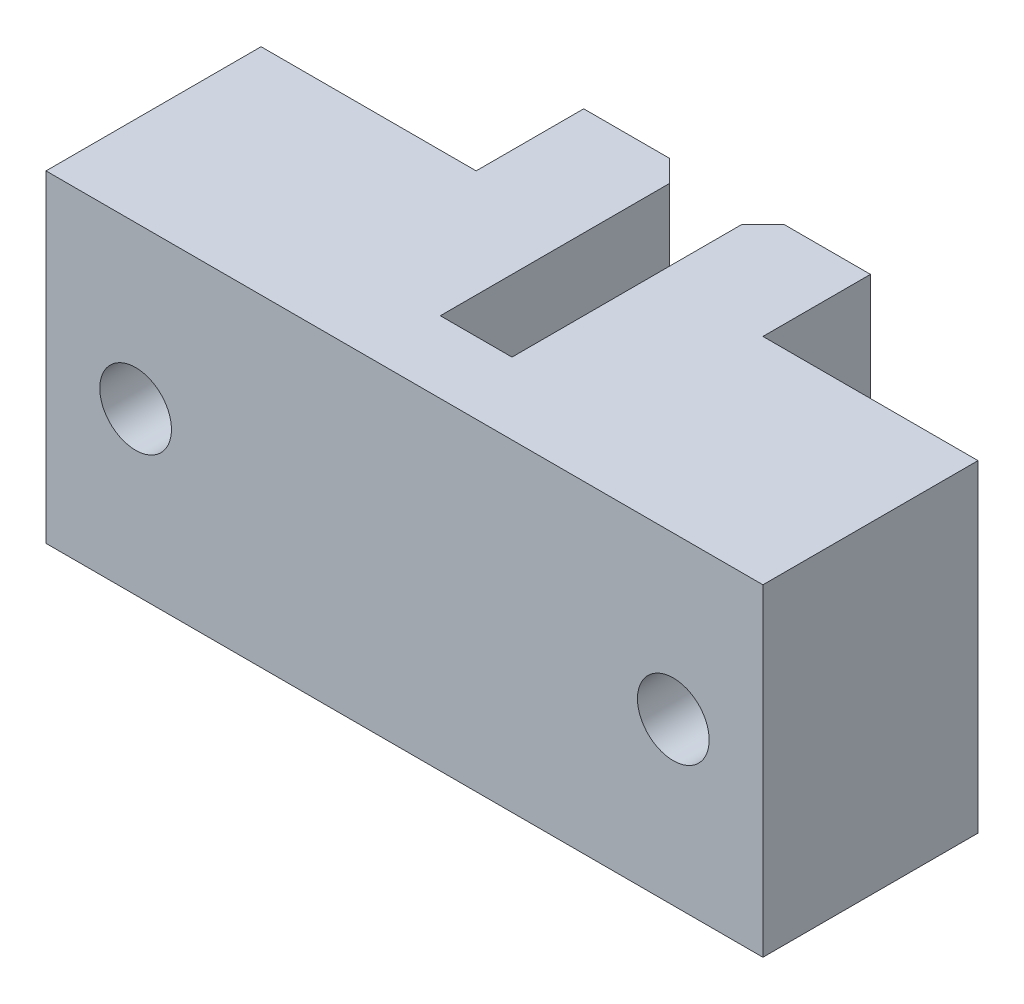
ISO-10303-21;
HEADER;
FILE_DESCRIPTION(('STEP AP214'),'2;1');
FILE_NAME('part.step','',(''),(''),'','','');
FILE_SCHEMA(('AUTOMOTIVE_DESIGN { 1 0 10303 214 1 1 1 1 }'));
ENDSEC;
DATA;
#1=APPLICATION_CONTEXT('core data for automotive mechanical design processes');
#2=APPLICATION_PROTOCOL_DEFINITION('international standard','automotive_design',2000,#1);
#3=PRODUCT_CONTEXT('',#1,'mechanical');
#4=PRODUCT('Part','Part','',(#3));
#5=PRODUCT_RELATED_PRODUCT_CATEGORY('part','',(#4));
#6=PRODUCT_DEFINITION_FORMATION('','',#4);
#7=PRODUCT_DEFINITION_CONTEXT('part definition',#1,'design');
#8=PRODUCT_DEFINITION('design','',#6,#7);
#9=PRODUCT_DEFINITION_SHAPE('','',#8);
#10=(LENGTH_UNIT() NAMED_UNIT(*) SI_UNIT(.MILLI.,.METRE.));
#11=(NAMED_UNIT(*) PLANE_ANGLE_UNIT() SI_UNIT($,.RADIAN.));
#12=(NAMED_UNIT(*) SI_UNIT($,.STERADIAN.) SOLID_ANGLE_UNIT());
#13=UNCERTAINTY_MEASURE_WITH_UNIT(LENGTH_MEASURE(1.E-05),#10,'distance_accuracy_value','');
#14=(GEOMETRIC_REPRESENTATION_CONTEXT(3) GLOBAL_UNCERTAINTY_ASSIGNED_CONTEXT((#13)) GLOBAL_UNIT_ASSIGNED_CONTEXT((#10,
#11,#12)) REPRESENTATION_CONTEXT('',''));
#15=CARTESIAN_POINT('',(0.,0.,0.));
#16=DIRECTION('',(0.,0.,1.));
#17=DIRECTION('',(1.,0.,0.));
#18=AXIS2_PLACEMENT_3D('',#15,#16,#17);
#19=CARTESIAN_POINT('',(-50.,22.5,0.));
#20=DIRECTION('',(1.,0.,0.));
#21=DIRECTION('',(0.,0.,-1.));
#22=AXIS2_PLACEMENT_3D('',#19,#20,#21);
#23=PLANE('',#22);
#24=DIRECTION('',(0.,0.,1.));
#25=VECTOR('',#24,1.);
#26=CARTESIAN_POINT('',(-50.,-22.5,0.));
#27=LINE('',#26,#25);
#28=CARTESIAN_POINT('',(-50.,-22.5,-30.));
#29=VERTEX_POINT('',#28);
#30=CARTESIAN_POINT('',(-50.,-22.5,0.));
#31=VERTEX_POINT('',#30);
#32=EDGE_CURVE('E166',#29,#31,#27,.T.);
#33=ORIENTED_EDGE('',*,*,#32,.T.);
#34=DIRECTION('',(0.,-1.,0.));
#35=VECTOR('',#34,1.);
#36=CARTESIAN_POINT('',(-50.,22.5,0.));
#37=LINE('',#36,#35);
#38=CARTESIAN_POINT('',(-50.,22.5,0.));
#39=VERTEX_POINT('',#38);
#40=EDGE_CURVE('E11',#39,#31,#37,.T.);
#41=ORIENTED_EDGE('',*,*,#40,.F.);
#42=DIRECTION('',(0.,0.,1.));
#43=VECTOR('',#42,1.);
#44=CARTESIAN_POINT('',(-50.,22.5,0.));
#45=LINE('',#44,#43);
#46=CARTESIAN_POINT('',(-50.,22.5,-30.));
#47=VERTEX_POINT('',#46);
#48=EDGE_CURVE('E193',#47,#39,#45,.T.);
#49=ORIENTED_EDGE('',*,*,#48,.F.);
#50=DIRECTION('',(0.,-1.,0.));
#51=VECTOR('',#50,1.);
#52=CARTESIAN_POINT('',(-50.,22.5,-30.));
#53=LINE('',#52,#51);
#54=EDGE_CURVE('E162',#47,#29,#53,.T.);
#55=ORIENTED_EDGE('',*,*,#54,.T.);
#56=EDGE_LOOP('',(#33,#41,#49,#55));
#57=FACE_BOUND('',#56,.T.);
#58=ADVANCED_FACE('F34',(#57),#23,.F.);
#59=CARTESIAN_POINT('',(50.,22.5,0.));
#60=DIRECTION('',(0.,0.,-1.));
#61=DIRECTION('',(-1.,0.,0.));
#62=AXIS2_PLACEMENT_3D('',#59,#60,#61);
#63=PLANE('',#62);
#64=CARTESIAN_POINT('',(37.5000000000001,0.,0.));
#65=DIRECTION('',(0.,0.,-1.));
#66=DIRECTION('',(-1.,0.,0.));
#67=AXIS2_PLACEMENT_3D('',#64,#65,#66);
#68=CIRCLE('',#67,5.);
#69=CARTESIAN_POINT('',(32.5000000000001,0.,0.));
#70=VERTEX_POINT('',#69);
#71=EDGE_CURVE('E415',#70,#70,#68,.T.);
#72=ORIENTED_EDGE('',*,*,#71,.T.);
#73=EDGE_LOOP('',(#72));
#74=FACE_BOUND('',#73,.T.);
#75=CARTESIAN_POINT('',(-37.5000000000001,0.,0.));
#76=DIRECTION('',(0.,0.,-1.));
#77=DIRECTION('',(-1.,0.,0.));
#78=AXIS2_PLACEMENT_3D('',#75,#76,#77);
#79=CIRCLE('',#78,5.);
#80=CARTESIAN_POINT('',(-42.5000000000001,0.,0.));
#81=VERTEX_POINT('',#80);
#82=EDGE_CURVE('E428',#81,#81,#79,.F.);
#83=ORIENTED_EDGE('',*,*,#82,.F.);
#84=EDGE_LOOP('',(#83));
#85=FACE_BOUND('',#84,.T.);
#86=DIRECTION('',(1.,0.,0.));
#87=VECTOR('',#86,1.);
#88=CARTESIAN_POINT('',(50.,-22.5,0.));
#89=LINE('',#88,#87);
#90=CARTESIAN_POINT('',(50.,-22.5,0.));
#91=VERTEX_POINT('',#90);
#92=EDGE_CURVE('E169',#31,#91,#89,.T.);
#93=ORIENTED_EDGE('',*,*,#92,.T.);
#94=DIRECTION('',(0.,-1.,0.));
#95=VECTOR('',#94,1.);
#96=CARTESIAN_POINT('',(50.,22.5,0.));
#97=LINE('',#96,#95);
#98=CARTESIAN_POINT('',(50.,22.5,0.));
#99=VERTEX_POINT('',#98);
#100=EDGE_CURVE('E42',#99,#91,#97,.T.);
#101=ORIENTED_EDGE('',*,*,#100,.F.);
#102=DIRECTION('',(1.,0.,0.));
#103=VECTOR('',#102,1.);
#104=CARTESIAN_POINT('',(50.,22.5,0.));
#105=LINE('',#104,#103);
#106=EDGE_CURVE('E111',#39,#99,#105,.T.);
#107=ORIENTED_EDGE('',*,*,#106,.F.);
#108=ORIENTED_EDGE('',*,*,#40,.T.);
#109=EDGE_LOOP('',(#93,#101,#107,#108));
#110=FACE_BOUND('',#109,.T.);
#111=ADVANCED_FACE('F283',(#74,#85,#110),#63,.F.);
#112=CARTESIAN_POINT('',(50.,22.5,0.));
#113=DIRECTION('',(-1.,0.,0.));
#114=DIRECTION('',(0.,0.,1.));
#115=AXIS2_PLACEMENT_3D('',#112,#113,#114);
#116=PLANE('',#115);
#117=DIRECTION('',(0.,0.,-1.));
#118=VECTOR('',#117,1.);
#119=CARTESIAN_POINT('',(50.,-22.5,0.));
#120=LINE('',#119,#118);
#121=CARTESIAN_POINT('',(50.,-22.5,-30.));
#122=VERTEX_POINT('',#121);
#123=EDGE_CURVE('E172',#91,#122,#120,.T.);
#124=ORIENTED_EDGE('',*,*,#123,.T.);
#125=DIRECTION('',(0.,-1.,0.));
#126=VECTOR('',#125,1.);
#127=CARTESIAN_POINT('',(50.,22.5,-30.));
#128=LINE('',#127,#126);
#129=CARTESIAN_POINT('',(50.,22.5,-30.));
#130=VERTEX_POINT('',#129);
#131=EDGE_CURVE('E218',#130,#122,#128,.T.);
#132=ORIENTED_EDGE('',*,*,#131,.F.);
#133=DIRECTION('',(0.,0.,-1.));
#134=VECTOR('',#133,1.);
#135=CARTESIAN_POINT('',(50.,22.5,0.));
#136=LINE('',#135,#134);
#137=EDGE_CURVE('E226',#99,#130,#136,.T.);
#138=ORIENTED_EDGE('',*,*,#137,.F.);
#139=ORIENTED_EDGE('',*,*,#100,.T.);
#140=EDGE_LOOP('',(#124,#132,#138,#139));
#141=FACE_BOUND('',#140,.T.);
#142=ADVANCED_FACE('F224',(#141),#116,.F.);
#143=CARTESIAN_POINT('',(50.,22.5,-30.));
#144=DIRECTION('',(0.,0.,1.));
#145=DIRECTION('',(1.,0.,0.));
#146=AXIS2_PLACEMENT_3D('',#143,#144,#145);
#147=PLANE('',#146);
#148=CARTESIAN_POINT('',(37.5000000000001,0.,-30.));
#149=DIRECTION('',(0.,0.,1.));
#150=DIRECTION('',(1.,0.,0.));
#151=AXIS2_PLACEMENT_3D('',#148,#149,#150);
#152=CIRCLE('',#151,8.);
#153=CARTESIAN_POINT('',(45.5000000000001,0.,-30.));
#154=VERTEX_POINT('',#153);
#155=EDGE_CURVE('E417',#154,#154,#152,.T.);
#156=ORIENTED_EDGE('',*,*,#155,.T.);
#157=EDGE_LOOP('',(#156));
#158=FACE_BOUND('',#157,.T.);
#159=DIRECTION('',(-1.,0.,0.));
#160=VECTOR('',#159,1.);
#161=CARTESIAN_POINT('',(50.,-22.5,-30.));
#162=LINE('',#161,#160);
#163=CARTESIAN_POINT('',(20.,-22.5,-30.));
#164=VERTEX_POINT('',#163);
#165=EDGE_CURVE('E174',#122,#164,#162,.T.);
#166=ORIENTED_EDGE('',*,*,#165,.T.);
#167=DIRECTION('',(0.,-1.,0.));
#168=VECTOR('',#167,1.);
#169=CARTESIAN_POINT('',(20.,22.5,-30.));
#170=LINE('',#169,#168);
#171=CARTESIAN_POINT('',(20.,22.5,-30.));
#172=VERTEX_POINT('',#171);
#173=EDGE_CURVE('E215',#172,#164,#170,.T.);
#174=ORIENTED_EDGE('',*,*,#173,.F.);
#175=DIRECTION('',(-1.,0.,0.));
#176=VECTOR('',#175,1.);
#177=CARTESIAN_POINT('',(50.,22.5,-30.));
#178=LINE('',#177,#176);
#179=EDGE_CURVE('E244',#130,#172,#178,.T.);
#180=ORIENTED_EDGE('',*,*,#179,.F.);
#181=ORIENTED_EDGE('',*,*,#131,.T.);
#182=EDGE_LOOP('',(#166,#174,#180,#181));
#183=FACE_BOUND('',#182,.T.);
#184=ADVANCED_FACE('F235',(#158,#183),#147,.F.);
#185=CARTESIAN_POINT('',(20.,22.5,-30.));
#186=DIRECTION('',(-1.,0.,0.));
#187=DIRECTION('',(0.,0.,1.));
#188=AXIS2_PLACEMENT_3D('',#185,#186,#187);
#189=PLANE('',#188);
#190=DIRECTION('',(0.,0.,-1.));
#191=VECTOR('',#190,1.);
#192=CARTESIAN_POINT('',(20.,-22.5,-30.));
#193=LINE('',#192,#191);
#194=CARTESIAN_POINT('',(20.,-22.5,-45.));
#195=VERTEX_POINT('',#194);
#196=EDGE_CURVE('E176',#164,#195,#193,.T.);
#197=ORIENTED_EDGE('',*,*,#196,.T.);
#198=DIRECTION('',(0.,-1.,0.));
#199=VECTOR('',#198,1.);
#200=CARTESIAN_POINT('',(20.,22.5,-45.));
#201=LINE('',#200,#199);
#202=CARTESIAN_POINT('',(20.,22.5,-45.));
#203=VERTEX_POINT('',#202);
#204=EDGE_CURVE('E212',#203,#195,#201,.T.);
#205=ORIENTED_EDGE('',*,*,#204,.F.);
#206=DIRECTION('',(0.,0.,-1.));
#207=VECTOR('',#206,1.);
#208=CARTESIAN_POINT('',(20.,22.5,-30.));
#209=LINE('',#208,#207);
#210=EDGE_CURVE('E241',#172,#203,#209,.T.);
#211=ORIENTED_EDGE('',*,*,#210,.F.);
#212=ORIENTED_EDGE('',*,*,#173,.T.);
#213=EDGE_LOOP('',(#197,#205,#211,#212));
#214=FACE_BOUND('',#213,.T.);
#215=ADVANCED_FACE('F239',(#214),#189,.F.);
#216=CARTESIAN_POINT('',(20.,22.5,-45.));
#217=DIRECTION('',(0.,0.,1.));
#218=DIRECTION('',(1.,0.,0.));
#219=AXIS2_PLACEMENT_3D('',#216,#217,#218);
#220=PLANE('',#219);
#221=DIRECTION('',(-1.,0.,0.));
#222=VECTOR('',#221,1.);
#223=CARTESIAN_POINT('',(20.,-22.5,-45.));
#224=LINE('',#223,#222);
#225=CARTESIAN_POINT('',(7.99999999999999,-22.5,-45.));
#226=VERTEX_POINT('',#225);
#227=EDGE_CURVE('E178',#195,#226,#224,.T.);
#228=ORIENTED_EDGE('',*,*,#227,.T.);
#229=DIRECTION('',(0.,-1.,0.));
#230=VECTOR('',#229,1.);
#231=CARTESIAN_POINT('',(8.,22.5,-45.));
#232=LINE('',#231,#230);
#233=CARTESIAN_POINT('',(8.,22.5,-45.));
#234=VERTEX_POINT('',#233);
#235=EDGE_CURVE('E209',#234,#226,#232,.T.);
#236=ORIENTED_EDGE('',*,*,#235,.F.);
#237=DIRECTION('',(-1.,0.,0.));
#238=VECTOR('',#237,1.);
#239=CARTESIAN_POINT('',(20.,22.5,-45.));
#240=LINE('',#239,#238);
#241=EDGE_CURVE('E243',#203,#234,#240,.T.);
#242=ORIENTED_EDGE('',*,*,#241,.F.);
#243=ORIENTED_EDGE('',*,*,#204,.T.);
#244=EDGE_LOOP('',(#228,#236,#242,#243));
#245=FACE_BOUND('',#244,.T.);
#246=ADVANCED_FACE('F300',(#245),#220,.F.);
#247=CARTESIAN_POINT('',(8.,22.5,-45.));
#248=DIRECTION('',(0.707106781186553,0.,0.707106781186542));
#249=DIRECTION('',(0.707106781186542,0.,-0.707106781186553));
#250=AXIS2_PLACEMENT_3D('',#247,#248,#249);
#251=PLANE('',#250);
#252=DIRECTION('',(-0.707106781186542,0.,0.707106781186553));
#253=VECTOR('',#252,1.);
#254=CARTESIAN_POINT('',(7.99999999999999,-22.5,-45.));
#255=LINE('',#254,#253);
#256=CARTESIAN_POINT('',(4.99999999999999,-22.5,-41.9999999999999));
#257=VERTEX_POINT('',#256);
#258=EDGE_CURVE('E180',#226,#257,#255,.T.);
#259=ORIENTED_EDGE('',*,*,#258,.T.);
#260=DIRECTION('',(0.,-1.,0.));
#261=VECTOR('',#260,1.);
#262=CARTESIAN_POINT('',(5.,22.5,-42.));
#263=LINE('',#262,#261);
#264=CARTESIAN_POINT('',(5.,22.5,-42.));
#265=VERTEX_POINT('',#264);
#266=EDGE_CURVE('E206',#265,#257,#263,.T.);
#267=ORIENTED_EDGE('',*,*,#266,.F.);
#268=DIRECTION('',(-0.707106781186542,0.,0.707106781186553));
#269=VECTOR('',#268,1.);
#270=CARTESIAN_POINT('',(8.,22.5,-45.));
#271=LINE('',#270,#269);
#272=EDGE_CURVE('E246',#234,#265,#271,.T.);
#273=ORIENTED_EDGE('',*,*,#272,.F.);
#274=ORIENTED_EDGE('',*,*,#235,.T.);
#275=EDGE_LOOP('',(#259,#267,#273,#274));
#276=FACE_BOUND('',#275,.T.);
#277=ADVANCED_FACE('F303',(#276),#251,.F.);
#278=CARTESIAN_POINT('',(5.,22.5,-42.));
#279=DIRECTION('',(1.,0.,0.));
#280=DIRECTION('',(0.,0.,-1.));
#281=AXIS2_PLACEMENT_3D('',#278,#279,#280);
#282=PLANE('',#281);
#283=DIRECTION('',(0.,0.,1.));
#284=VECTOR('',#283,1.);
#285=CARTESIAN_POINT('',(4.99999999999999,-22.5,-41.9999999999999));
#286=LINE('',#285,#284);
#287=CARTESIAN_POINT('',(4.99999999999999,-22.5,-10.));
#288=VERTEX_POINT('',#287);
#289=EDGE_CURVE('E182',#257,#288,#286,.T.);
#290=ORIENTED_EDGE('',*,*,#289,.T.);
#291=DIRECTION('',(0.,-1.,0.));
#292=VECTOR('',#291,1.);
#293=CARTESIAN_POINT('',(5.,22.5,-10.));
#294=LINE('',#293,#292);
#295=CARTESIAN_POINT('',(5.,22.5,-10.));
#296=VERTEX_POINT('',#295);
#297=EDGE_CURVE('E203',#296,#288,#294,.T.);
#298=ORIENTED_EDGE('',*,*,#297,.F.);
#299=DIRECTION('',(0.,0.,1.));
#300=VECTOR('',#299,1.);
#301=CARTESIAN_POINT('',(5.,22.5,-42.));
#302=LINE('',#301,#300);
#303=EDGE_CURVE('E252',#265,#296,#302,.T.);
#304=ORIENTED_EDGE('',*,*,#303,.F.);
#305=ORIENTED_EDGE('',*,*,#266,.T.);
#306=EDGE_LOOP('',(#290,#298,#304,#305));
#307=FACE_BOUND('',#306,.T.);
#308=ADVANCED_FACE('F307',(#307),#282,.F.);
#309=CARTESIAN_POINT('',(-5.00000000000002,22.5,-10.));
#310=DIRECTION('',(0.,0.,1.));
#311=DIRECTION('',(1.,0.,0.));
#312=AXIS2_PLACEMENT_3D('',#309,#310,#311);
#313=PLANE('',#312);
#314=DIRECTION('',(-1.,0.,0.));
#315=VECTOR('',#314,1.);
#316=CARTESIAN_POINT('',(-5.,-22.5,-10.));
#317=LINE('',#316,#315);
#318=CARTESIAN_POINT('',(-5.,-22.5,-10.));
#319=VERTEX_POINT('',#318);
#320=EDGE_CURVE('E184',#288,#319,#317,.T.);
#321=ORIENTED_EDGE('',*,*,#320,.T.);
#322=DIRECTION('',(0.,-1.,0.));
#323=VECTOR('',#322,1.);
#324=CARTESIAN_POINT('',(-5.00000000000002,22.5,-10.));
#325=LINE('',#324,#323);
#326=CARTESIAN_POINT('',(-5.00000000000002,22.5,-10.));
#327=VERTEX_POINT('',#326);
#328=EDGE_CURVE('E200',#327,#319,#325,.T.);
#329=ORIENTED_EDGE('',*,*,#328,.F.);
#330=DIRECTION('',(-1.,0.,0.));
#331=VECTOR('',#330,1.);
#332=CARTESIAN_POINT('',(-5.00000000000002,22.5,-10.));
#333=LINE('',#332,#331);
#334=EDGE_CURVE('E254',#296,#327,#333,.T.);
#335=ORIENTED_EDGE('',*,*,#334,.F.);
#336=ORIENTED_EDGE('',*,*,#297,.T.);
#337=EDGE_LOOP('',(#321,#329,#335,#336));
#338=FACE_BOUND('',#337,.T.);
#339=ADVANCED_FACE('F311',(#338),#313,.F.);
#340=CARTESIAN_POINT('',(-5.,22.5,-42.));
#341=DIRECTION('',(-1.,0.,0.));
#342=DIRECTION('',(0.,0.,1.));
#343=AXIS2_PLACEMENT_3D('',#340,#341,#342);
#344=PLANE('',#343);
#345=DIRECTION('',(0.,0.,-1.));
#346=VECTOR('',#345,1.);
#347=CARTESIAN_POINT('',(-5.,-22.5,-41.9999999999999));
#348=LINE('',#347,#346);
#349=CARTESIAN_POINT('',(-5.,-22.5,-41.9999999999999));
#350=VERTEX_POINT('',#349);
#351=EDGE_CURVE('E186',#319,#350,#348,.T.);
#352=ORIENTED_EDGE('',*,*,#351,.T.);
#353=DIRECTION('',(0.,-1.,0.));
#354=VECTOR('',#353,1.);
#355=CARTESIAN_POINT('',(-5.,22.5,-42.));
#356=LINE('',#355,#354);
#357=CARTESIAN_POINT('',(-5.,22.5,-42.));
#358=VERTEX_POINT('',#357);
#359=EDGE_CURVE('E197',#358,#350,#356,.T.);
#360=ORIENTED_EDGE('',*,*,#359,.F.);
#361=DIRECTION('',(0.,0.,-1.));
#362=VECTOR('',#361,1.);
#363=CARTESIAN_POINT('',(-5.,22.5,-42.));
#364=LINE('',#363,#362);
#365=EDGE_CURVE('E256',#327,#358,#364,.T.);
#366=ORIENTED_EDGE('',*,*,#365,.F.);
#367=ORIENTED_EDGE('',*,*,#328,.T.);
#368=EDGE_LOOP('',(#352,#360,#366,#367));
#369=FACE_BOUND('',#368,.T.);
#370=ADVANCED_FACE('F262',(#369),#344,.F.);
#371=CARTESIAN_POINT('',(-8.,22.5,-45.));
#372=DIRECTION('',(-0.707106781186553,0.,0.707106781186542));
#373=DIRECTION('',(0.707106781186542,0.,0.707106781186553));
#374=AXIS2_PLACEMENT_3D('',#371,#372,#373);
#375=PLANE('',#374);
#376=DIRECTION('',(-0.707106781186542,0.,-0.707106781186553));
#377=VECTOR('',#376,1.);
#378=CARTESIAN_POINT('',(-8.,-22.5,-45.));
#379=LINE('',#378,#377);
#380=CARTESIAN_POINT('',(-8.,-22.5,-45.));
#381=VERTEX_POINT('',#380);
#382=EDGE_CURVE('E188',#350,#381,#379,.T.);
#383=ORIENTED_EDGE('',*,*,#382,.T.);
#384=DIRECTION('',(0.,-1.,0.));
#385=VECTOR('',#384,1.);
#386=CARTESIAN_POINT('',(-8.,22.5,-45.));
#387=LINE('',#386,#385);
#388=CARTESIAN_POINT('',(-8.,22.5,-45.));
#389=VERTEX_POINT('',#388);
#390=EDGE_CURVE('E157',#389,#381,#387,.T.);
#391=ORIENTED_EDGE('',*,*,#390,.F.);
#392=DIRECTION('',(-0.707106781186542,0.,-0.707106781186553));
#393=VECTOR('',#392,1.);
#394=CARTESIAN_POINT('',(-8.,22.5,-45.));
#395=LINE('',#394,#393);
#396=EDGE_CURVE('E148',#358,#389,#395,.T.);
#397=ORIENTED_EDGE('',*,*,#396,.F.);
#398=ORIENTED_EDGE('',*,*,#359,.T.);
#399=EDGE_LOOP('',(#383,#391,#397,#398));
#400=FACE_BOUND('',#399,.T.);
#401=ADVANCED_FACE('F266',(#400),#375,.F.);
#402=CARTESIAN_POINT('',(-20.,22.5,-45.));
#403=DIRECTION('',(0.,0.,1.));
#404=DIRECTION('',(1.,0.,0.));
#405=AXIS2_PLACEMENT_3D('',#402,#403,#404);
#406=PLANE('',#405);
#407=DIRECTION('',(-1.,0.,0.));
#408=VECTOR('',#407,1.);
#409=CARTESIAN_POINT('',(-20.,-22.5,-45.));
#410=LINE('',#409,#408);
#411=CARTESIAN_POINT('',(-20.,-22.5,-45.));
#412=VERTEX_POINT('',#411);
#413=EDGE_CURVE('E156',#381,#412,#410,.T.);
#414=ORIENTED_EDGE('',*,*,#413,.T.);
#415=DIRECTION('',(0.,-1.,0.));
#416=VECTOR('',#415,1.);
#417=CARTESIAN_POINT('',(-20.,22.5,-45.));
#418=LINE('',#417,#416);
#419=CARTESIAN_POINT('',(-20.,22.5,-45.));
#420=VERTEX_POINT('',#419);
#421=EDGE_CURVE('E153',#420,#412,#418,.T.);
#422=ORIENTED_EDGE('',*,*,#421,.F.);
#423=DIRECTION('',(-1.,0.,0.));
#424=VECTOR('',#423,1.);
#425=CARTESIAN_POINT('',(-20.,22.5,-45.));
#426=LINE('',#425,#424);
#427=EDGE_CURVE('E142',#389,#420,#426,.T.);
#428=ORIENTED_EDGE('',*,*,#427,.F.);
#429=ORIENTED_EDGE('',*,*,#390,.T.);
#430=EDGE_LOOP('',(#414,#422,#428,#429));
#431=FACE_BOUND('',#430,.T.);
#432=ADVANCED_FACE('F154',(#431),#406,.F.);
#433=CARTESIAN_POINT('',(-20.,22.5,-30.));
#434=DIRECTION('',(1.,0.,0.));
#435=DIRECTION('',(0.,0.,-1.));
#436=AXIS2_PLACEMENT_3D('',#433,#434,#435);
#437=PLANE('',#436);
#438=DIRECTION('',(0.,0.,1.));
#439=VECTOR('',#438,1.);
#440=CARTESIAN_POINT('',(-20.,-22.5,-30.));
#441=LINE('',#440,#439);
#442=CARTESIAN_POINT('',(-20.,-22.5,-30.));
#443=VERTEX_POINT('',#442);
#444=EDGE_CURVE('E97',#412,#443,#441,.T.);
#445=ORIENTED_EDGE('',*,*,#444,.T.);
#446=DIRECTION('',(0.,-1.,0.));
#447=VECTOR('',#446,1.);
#448=CARTESIAN_POINT('',(-20.,22.5,-30.));
#449=LINE('',#448,#447);
#450=CARTESIAN_POINT('',(-20.,22.5,-30.));
#451=VERTEX_POINT('',#450);
#452=EDGE_CURVE('E158',#451,#443,#449,.T.);
#453=ORIENTED_EDGE('',*,*,#452,.F.);
#454=DIRECTION('',(0.,0.,1.));
#455=VECTOR('',#454,1.);
#456=CARTESIAN_POINT('',(-20.,22.5,-30.));
#457=LINE('',#456,#455);
#458=EDGE_CURVE('E146',#420,#451,#457,.T.);
#459=ORIENTED_EDGE('',*,*,#458,.F.);
#460=ORIENTED_EDGE('',*,*,#421,.T.);
#461=EDGE_LOOP('',(#445,#453,#459,#460));
#462=FACE_BOUND('',#461,.T.);
#463=ADVANCED_FACE('F160',(#462),#437,.F.);
#464=CARTESIAN_POINT('',(-50.,22.5,-30.));
#465=DIRECTION('',(0.,0.,1.));
#466=DIRECTION('',(1.,0.,0.));
#467=AXIS2_PLACEMENT_3D('',#464,#465,#466);
#468=PLANE('',#467);
#469=CARTESIAN_POINT('',(-37.5000000000001,0.,-30.));
#470=DIRECTION('',(0.,0.,-1.));
#471=DIRECTION('',(-1.,0.,0.));
#472=AXIS2_PLACEMENT_3D('',#469,#470,#471);
#473=CIRCLE('',#472,8.);
#474=CARTESIAN_POINT('',(-45.5000000000001,0.,-30.));
#475=VERTEX_POINT('',#474);
#476=EDGE_CURVE('E431',#475,#475,#473,.T.);
#477=ORIENTED_EDGE('',*,*,#476,.F.);
#478=EDGE_LOOP('',(#477));
#479=FACE_BOUND('',#478,.T.);
#480=DIRECTION('',(-1.,0.,0.));
#481=VECTOR('',#480,1.);
#482=CARTESIAN_POINT('',(-50.,-22.5,-30.));
#483=LINE('',#482,#481);
#484=EDGE_CURVE('E103',#443,#29,#483,.T.);
#485=ORIENTED_EDGE('',*,*,#484,.T.);
#486=ORIENTED_EDGE('',*,*,#54,.F.);
#487=DIRECTION('',(-1.,0.,0.));
#488=VECTOR('',#487,1.);
#489=CARTESIAN_POINT('',(-50.,22.5,-30.));
#490=LINE('',#489,#488);
#491=EDGE_CURVE('E50',#451,#47,#490,.T.);
#492=ORIENTED_EDGE('',*,*,#491,.F.);
#493=ORIENTED_EDGE('',*,*,#452,.T.);
#494=EDGE_LOOP('',(#485,#486,#492,#493));
#495=FACE_BOUND('',#494,.T.);
#496=ADVANCED_FACE('F270',(#479,#495),#468,.F.);
#497=CARTESIAN_POINT('',(0.,22.5,0.));
#498=DIRECTION('',(0.,-1.,0.));
#499=DIRECTION('',(0.,0.,-1.));
#500=AXIS2_PLACEMENT_3D('',#497,#498,#499);
#501=PLANE('',#500);
#502=ORIENTED_EDGE('',*,*,#48,.T.);
#503=ORIENTED_EDGE('',*,*,#106,.T.);
#504=ORIENTED_EDGE('',*,*,#137,.T.);
#505=ORIENTED_EDGE('',*,*,#179,.T.);
#506=ORIENTED_EDGE('',*,*,#210,.T.);
#507=ORIENTED_EDGE('',*,*,#241,.T.);
#508=ORIENTED_EDGE('',*,*,#272,.T.);
#509=ORIENTED_EDGE('',*,*,#303,.T.);
#510=ORIENTED_EDGE('',*,*,#334,.T.);
#511=ORIENTED_EDGE('',*,*,#365,.T.);
#512=ORIENTED_EDGE('',*,*,#396,.T.);
#513=ORIENTED_EDGE('',*,*,#427,.T.);
#514=ORIENTED_EDGE('',*,*,#458,.T.);
#515=ORIENTED_EDGE('',*,*,#491,.T.);
#516=EDGE_LOOP('',(#502,#503,#504,#505,#506,#507,#508,#509,#510,#511,#512,#513,#514,#515));
#517=FACE_BOUND('',#516,.T.);
#518=ADVANCED_FACE('F144',(#517),#501,.F.);
#519=CARTESIAN_POINT('',(0.,-22.5,0.));
#520=DIRECTION('',(0.,-1.,0.));
#521=DIRECTION('',(0.,0.,-1.));
#522=AXIS2_PLACEMENT_3D('',#519,#520,#521);
#523=PLANE('',#522);
#524=ORIENTED_EDGE('',*,*,#32,.F.);
#525=ORIENTED_EDGE('',*,*,#484,.F.);
#526=ORIENTED_EDGE('',*,*,#444,.F.);
#527=ORIENTED_EDGE('',*,*,#413,.F.);
#528=ORIENTED_EDGE('',*,*,#382,.F.);
#529=ORIENTED_EDGE('',*,*,#351,.F.);
#530=ORIENTED_EDGE('',*,*,#320,.F.);
#531=ORIENTED_EDGE('',*,*,#289,.F.);
#532=ORIENTED_EDGE('',*,*,#258,.F.);
#533=ORIENTED_EDGE('',*,*,#227,.F.);
#534=ORIENTED_EDGE('',*,*,#196,.F.);
#535=ORIENTED_EDGE('',*,*,#165,.F.);
#536=ORIENTED_EDGE('',*,*,#123,.F.);
#537=ORIENTED_EDGE('',*,*,#92,.F.);
#538=EDGE_LOOP('',(#524,#525,#526,#527,#528,#529,#530,#531,#532,#533,#534,#535,#536,#537));
#539=FACE_BOUND('',#538,.T.);
#540=ADVANCED_FACE('F230',(#539),#523,.T.);
#541=CARTESIAN_POINT('',(-37.5000000000001,0.,-20.));
#542=DIRECTION('',(0.,0.,-1.));
#543=DIRECTION('',(-1.,0.,0.));
#544=AXIS2_PLACEMENT_3D('',#541,#542,#543);
#545=CYLINDRICAL_SURFACE('',#544,8.);
#546=CARTESIAN_POINT('',(-37.5000000000001,0.,-20.));
#547=DIRECTION('',(0.,0.,-1.));
#548=DIRECTION('',(-1.,0.,0.));
#549=AXIS2_PLACEMENT_3D('',#546,#547,#548);
#550=CIRCLE('',#549,8.);
#551=CARTESIAN_POINT('',(-45.5000000000001,0.,-20.));
#552=VERTEX_POINT('',#551);
#553=EDGE_CURVE('E170',#552,#552,#550,.T.);
#554=ORIENTED_EDGE('',*,*,#553,.F.);
#555=EDGE_LOOP('',(#554));
#556=FACE_BOUND('',#555,.T.);
#557=ORIENTED_EDGE('',*,*,#476,.T.);
#558=EDGE_LOOP('',(#557));
#559=FACE_BOUND('',#558,.T.);
#560=ADVANCED_FACE('F348',(#556,#559),#545,.F.);
#561=CARTESIAN_POINT('',(-37.5000000000001,0.,-20.));
#562=DIRECTION('',(0.,0.,-1.));
#563=DIRECTION('',(-1.,0.,0.));
#564=AXIS2_PLACEMENT_3D('',#561,#562,#563);
#565=PLANE('',#564);
#566=CARTESIAN_POINT('',(-37.5000000000001,0.,-20.));
#567=DIRECTION('',(0.,0.,-1.));
#568=DIRECTION('',(-1.,0.,0.));
#569=AXIS2_PLACEMENT_3D('',#566,#567,#568);
#570=CIRCLE('',#569,5.);
#571=CARTESIAN_POINT('',(-42.5000000000001,0.,-20.));
#572=VERTEX_POINT('',#571);
#573=EDGE_CURVE('E423',#572,#572,#570,.T.);
#574=ORIENTED_EDGE('',*,*,#573,.F.);
#575=EDGE_LOOP('',(#574));
#576=FACE_BOUND('',#575,.T.);
#577=ORIENTED_EDGE('',*,*,#553,.T.);
#578=EDGE_LOOP('',(#577));
#579=FACE_BOUND('',#578,.T.);
#580=ADVANCED_FACE('F356',(#576,#579),#565,.T.);
#581=CARTESIAN_POINT('',(-37.5000000000001,0.,0.001000000000001));
#582=DIRECTION('',(0.,0.,-1.));
#583=DIRECTION('',(-1.,0.,0.));
#584=AXIS2_PLACEMENT_3D('',#581,#582,#583);
#585=CYLINDRICAL_SURFACE('',#584,5.);
#586=ORIENTED_EDGE('',*,*,#573,.T.);
#587=EDGE_LOOP('',(#586));
#588=FACE_BOUND('',#587,.T.);
#589=ORIENTED_EDGE('',*,*,#82,.T.);
#590=EDGE_LOOP('',(#589));
#591=FACE_BOUND('',#590,.T.);
#592=ADVANCED_FACE('F366',(#588,#591),#585,.F.);
#593=CARTESIAN_POINT('',(37.5000000000001,0.,-20.));
#594=DIRECTION('',(0.,0.,-1.));
#595=DIRECTION('',(-1.,0.,0.));
#596=AXIS2_PLACEMENT_3D('',#593,#594,#595);
#597=CYLINDRICAL_SURFACE('',#596,8.);
#598=CARTESIAN_POINT('',(37.5000000000001,0.,-20.));
#599=DIRECTION('',(0.,0.,1.));
#600=DIRECTION('',(1.,0.,0.));
#601=AXIS2_PLACEMENT_3D('',#598,#599,#600);
#602=CIRCLE('',#601,8.);
#603=CARTESIAN_POINT('',(45.5000000000001,0.,-20.));
#604=VERTEX_POINT('',#603);
#605=EDGE_CURVE('E420',#604,#604,#602,.T.);
#606=ORIENTED_EDGE('',*,*,#605,.T.);
#607=EDGE_LOOP('',(#606));
#608=FACE_BOUND('',#607,.T.);
#609=ORIENTED_EDGE('',*,*,#155,.F.);
#610=EDGE_LOOP('',(#609));
#611=FACE_BOUND('',#610,.T.);
#612=ADVANCED_FACE('F376',(#608,#611),#597,.F.);
#613=CARTESIAN_POINT('',(37.5000000000001,0.,-20.));
#614=DIRECTION('',(0.,0.,-1.));
#615=DIRECTION('',(1.,0.,0.));
#616=AXIS2_PLACEMENT_3D('',#613,#614,#615);
#617=PLANE('',#616);
#618=CARTESIAN_POINT('',(37.5000000000001,0.,-20.));
#619=DIRECTION('',(0.,0.,1.));
#620=DIRECTION('',(1.,0.,0.));
#621=AXIS2_PLACEMENT_3D('',#618,#619,#620);
#622=CIRCLE('',#621,5.);
#623=CARTESIAN_POINT('',(42.5000000000001,0.,-20.));
#624=VERTEX_POINT('',#623);
#625=EDGE_CURVE('E413',#624,#624,#622,.T.);
#626=ORIENTED_EDGE('',*,*,#625,.T.);
#627=EDGE_LOOP('',(#626));
#628=FACE_BOUND('',#627,.T.);
#629=ORIENTED_EDGE('',*,*,#605,.F.);
#630=EDGE_LOOP('',(#629));
#631=FACE_BOUND('',#630,.T.);
#632=ADVANCED_FACE('F386',(#628,#631),#617,.T.);
#633=CARTESIAN_POINT('',(37.5000000000001,0.,0.000999999999994061));
#634=DIRECTION('',(0.,0.,-1.));
#635=DIRECTION('',(-1.,0.,0.));
#636=AXIS2_PLACEMENT_3D('',#633,#634,#635);
#637=CYLINDRICAL_SURFACE('',#636,5.);
#638=ORIENTED_EDGE('',*,*,#625,.F.);
#639=EDGE_LOOP('',(#638));
#640=FACE_BOUND('',#639,.T.);
#641=ORIENTED_EDGE('',*,*,#71,.F.);
#642=EDGE_LOOP('',(#641));
#643=FACE_BOUND('',#642,.T.);
#644=ADVANCED_FACE('F396',(#640,#643),#637,.F.);
#645=CLOSED_SHELL('',(#58,#111,#142,#184,#215,#246,#277,#308,#339,#370,#401,#432,#463,#496,#518,
#540,#560,#580,#592,#612,#632,#644));
#646=MANIFOLD_SOLID_BREP('B2',#645);
#647=ADVANCED_BREP_SHAPE_REPRESENTATION('',(#18,#646),#14);
#648=SHAPE_DEFINITION_REPRESENTATION(#9,#647);
ENDSEC;
END-ISO-10303-21;
